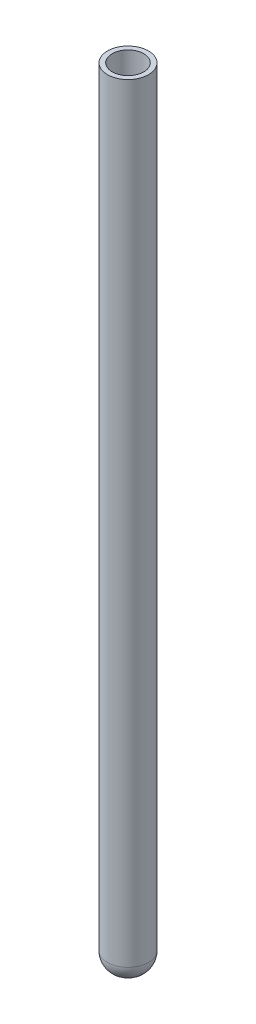
ISO-10303-21;
HEADER;
FILE_DESCRIPTION(('STEP AP214'),'2;1');
FILE_NAME('part.step','',(''),(''),'','','');
FILE_SCHEMA(('AUTOMOTIVE_DESIGN { 1 0 10303 214 1 1 1 1 }'));
ENDSEC;
DATA;
#1=APPLICATION_CONTEXT('core data for automotive mechanical design processes');
#2=APPLICATION_PROTOCOL_DEFINITION('international standard','automotive_design',2000,#1);
#3=PRODUCT_CONTEXT('',#1,'mechanical');
#4=PRODUCT('Part','Part','',(#3));
#5=PRODUCT_RELATED_PRODUCT_CATEGORY('part','',(#4));
#6=PRODUCT_DEFINITION_FORMATION('','',#4);
#7=PRODUCT_DEFINITION_CONTEXT('part definition',#1,'design');
#8=PRODUCT_DEFINITION('design','',#6,#7);
#9=PRODUCT_DEFINITION_SHAPE('','',#8);
#10=(LENGTH_UNIT() NAMED_UNIT(*) SI_UNIT(.MILLI.,.METRE.));
#11=(NAMED_UNIT(*) PLANE_ANGLE_UNIT() SI_UNIT($,.RADIAN.));
#12=(NAMED_UNIT(*) SI_UNIT($,.STERADIAN.) SOLID_ANGLE_UNIT());
#13=UNCERTAINTY_MEASURE_WITH_UNIT(LENGTH_MEASURE(1.E-05),#10,'distance_accuracy_value','');
#14=(GEOMETRIC_REPRESENTATION_CONTEXT(3) GLOBAL_UNCERTAINTY_ASSIGNED_CONTEXT((#13)) GLOBAL_UNIT_ASSIGNED_CONTEXT((#10,
#11,#12)) REPRESENTATION_CONTEXT('',''));
#15=CARTESIAN_POINT('',(0.,0.,0.));
#16=DIRECTION('',(0.,0.,1.));
#17=DIRECTION('',(1.,0.,0.));
#18=AXIS2_PLACEMENT_3D('',#15,#16,#17);
#19=CARTESIAN_POINT('',(0.,0.,-0.345));
#20=DIRECTION('',(0.,-1.,0.));
#21=DIRECTION('',(0.,0.,-1.));
#22=AXIS2_PLACEMENT_3D('',#19,#20,#21);
#23=PLANE('',#22);
#24=CARTESIAN_POINT('',(0.,0.,0.));
#25=DIRECTION('',(0.,1.,0.));
#26=DIRECTION('',(0.,0.,1.));
#27=AXIS2_PLACEMENT_3D('',#24,#25,#26);
#28=CIRCLE('',#27,0.265000000000003);
#29=CARTESIAN_POINT('',(0.,0.,0.265000000000007));
#30=VERTEX_POINT('',#29);
#31=EDGE_CURVE('E44',#30,#30,#28,.T.);
#32=ORIENTED_EDGE('',*,*,#31,.F.);
#33=EDGE_LOOP('',(#32));
#34=FACE_BOUND('',#33,.T.);
#35=CARTESIAN_POINT('',(0.,0.,0.));
#36=DIRECTION('',(0.,1.,0.));
#37=DIRECTION('',(0.,0.,1.));
#38=AXIS2_PLACEMENT_3D('',#35,#36,#37);
#39=CIRCLE('',#38,0.345000000000004);
#40=CARTESIAN_POINT('',(0.,0.,0.345000000000007));
#41=VERTEX_POINT('',#40);
#42=EDGE_CURVE('E53',#41,#41,#39,.T.);
#43=ORIENTED_EDGE('',*,*,#42,.T.);
#44=EDGE_LOOP('',(#43));
#45=FACE_BOUND('',#44,.T.);
#46=ADVANCED_FACE('F33',(#34,#45),#23,.F.);
#47=CARTESIAN_POINT('',(0.,-10.,0.));
#48=DIRECTION('',(0.,1.,0.));
#49=DIRECTION('',(0.,0.,1.));
#50=AXIS2_PLACEMENT_3D('',#47,#48,#49);
#51=CYLINDRICAL_SURFACE('',#50,0.265000000000003);
#52=CARTESIAN_POINT('',(0.,-10.,0.));
#53=DIRECTION('',(0.,1.,0.));
#54=DIRECTION('',(0.,0.,1.));
#55=AXIS2_PLACEMENT_3D('',#52,#53,#54);
#56=CIRCLE('',#55,0.265000000000002);
#57=CARTESIAN_POINT('',(0.,-10.,0.265000000000002));
#58=VERTEX_POINT('',#57);
#59=EDGE_CURVE('E48',#58,#58,#56,.T.);
#60=ORIENTED_EDGE('',*,*,#59,.F.);
#61=EDGE_LOOP('',(#60));
#62=FACE_BOUND('',#61,.T.);
#63=ORIENTED_EDGE('',*,*,#31,.T.);
#64=EDGE_LOOP('',(#63));
#65=FACE_BOUND('',#64,.T.);
#66=ADVANCED_FACE('F70',(#62,#65),#51,.F.);
#67=CARTESIAN_POINT('',(0.,-10.,-0.265000000000001));
#68=DIRECTION('',(0.,-1.,0.));
#69=DIRECTION('',(0.,0.,-1.));
#70=AXIS2_PLACEMENT_3D('',#67,#68,#69);
#71=PLANE('',#70);
#72=ORIENTED_EDGE('',*,*,#59,.T.);
#73=EDGE_LOOP('',(#72));
#74=FACE_BOUND('',#73,.T.);
#75=ADVANCED_FACE('F67',(#74),#71,.F.);
#76=CARTESIAN_POINT('',(0.,-13.21,0.));
#77=DIRECTION('',(0.,1.,0.));
#78=DIRECTION('',(0.,0.,1.));
#79=AXIS2_PLACEMENT_3D('',#76,#77,#78);
#80=PLANE('',#79);
#81=CARTESIAN_POINT('',(0.,-13.21,0.));
#82=DIRECTION('',(0.,1.,0.));
#83=DIRECTION('',(0.,0.,1.));
#84=AXIS2_PLACEMENT_3D('',#81,#82,#83);
#85=CIRCLE('',#84,0.0450000000000016);
#86=CARTESIAN_POINT('',(0.,-13.21,0.0450000000000012));
#87=VERTEX_POINT('',#86);
#88=EDGE_CURVE('E10',#87,#87,#85,.F.);
#89=ORIENTED_EDGE('',*,*,#88,.T.);
#90=EDGE_LOOP('',(#89));
#91=FACE_BOUND('',#90,.T.);
#92=ADVANCED_FACE('F60',(#91),#80,.F.);
#93=CARTESIAN_POINT('',(0.,-10.,0.));
#94=DIRECTION('',(0.,1.,0.));
#95=DIRECTION('',(0.,0.,1.));
#96=AXIS2_PLACEMENT_3D('',#93,#94,#95);
#97=CYLINDRICAL_SURFACE('',#96,0.345000000000002);
#98=CARTESIAN_POINT('',(0.,-12.91,0.));
#99=DIRECTION('',(0.,1.,0.));
#100=DIRECTION('',(0.,0.,1.));
#101=AXIS2_PLACEMENT_3D('',#98,#99,#100);
#102=CIRCLE('',#101,0.345000000000002);
#103=CARTESIAN_POINT('',(0.,-12.91,0.345000000000001));
#104=VERTEX_POINT('',#103);
#105=EDGE_CURVE('E40',#104,#104,#102,.T.);
#106=ORIENTED_EDGE('',*,*,#105,.T.);
#107=EDGE_LOOP('',(#106));
#108=FACE_BOUND('',#107,.T.);
#109=ORIENTED_EDGE('',*,*,#42,.F.);
#110=EDGE_LOOP('',(#109));
#111=FACE_BOUND('',#110,.T.);
#112=ADVANCED_FACE('F58',(#108,#111),#97,.T.);
#113=CARTESIAN_POINT('',(0.,-12.91,0.));
#114=DIRECTION('',(0.,1.,0.));
#115=DIRECTION('',(0.,0.,1.));
#116=AXIS2_PLACEMENT_3D('',#113,#114,#115);
#117=DEGENERATE_TOROIDAL_SURFACE('',#116,0.0450000000000016,0.3,.T.);
#118=ORIENTED_EDGE('',*,*,#88,.F.);
#119=EDGE_LOOP('',(#118));
#120=FACE_BOUND('',#119,.T.);
#121=ORIENTED_EDGE('',*,*,#105,.F.);
#122=EDGE_LOOP('',(#121));
#123=FACE_BOUND('',#122,.T.);
#124=ADVANCED_FACE('F35',(#120,#123),#117,.T.);
#125=CLOSED_SHELL('',(#46,#66,#75,#92,#112,#124));
#126=MANIFOLD_SOLID_BREP('B2',#125);
#127=ADVANCED_BREP_SHAPE_REPRESENTATION('',(#18,#126),#14);
#128=SHAPE_DEFINITION_REPRESENTATION(#9,#127);
ENDSEC;
END-ISO-10303-21;
